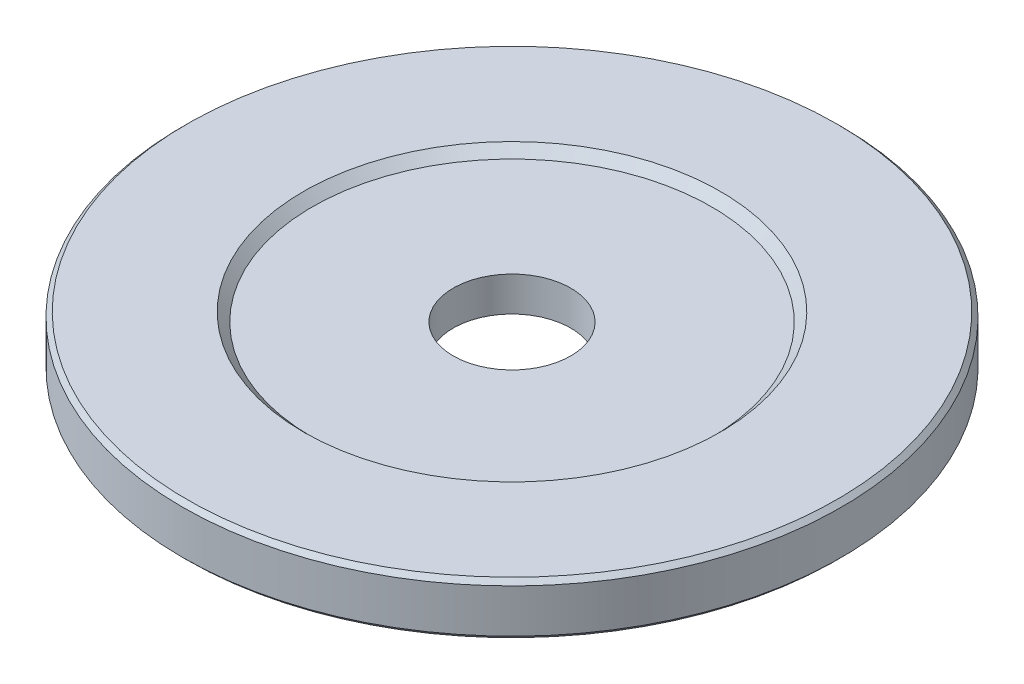
ISO-10303-21;
HEADER;
FILE_DESCRIPTION(('STEP AP214'),'2;1');
FILE_NAME('part.step','',(''),(''),'','','');
FILE_SCHEMA(('AUTOMOTIVE_DESIGN { 1 0 10303 214 1 1 1 1 }'));
ENDSEC;
DATA;
#1=APPLICATION_CONTEXT('core data for automotive mechanical design processes');
#2=APPLICATION_PROTOCOL_DEFINITION('international standard','automotive_design',2000,#1);
#3=PRODUCT_CONTEXT('',#1,'mechanical');
#4=PRODUCT('Part','Part','',(#3));
#5=PRODUCT_RELATED_PRODUCT_CATEGORY('part','',(#4));
#6=PRODUCT_DEFINITION_FORMATION('','',#4);
#7=PRODUCT_DEFINITION_CONTEXT('part definition',#1,'design');
#8=PRODUCT_DEFINITION('design','',#6,#7);
#9=PRODUCT_DEFINITION_SHAPE('','',#8);
#10=(LENGTH_UNIT() NAMED_UNIT(*) SI_UNIT(.MILLI.,.METRE.));
#11=(NAMED_UNIT(*) PLANE_ANGLE_UNIT() SI_UNIT($,.RADIAN.));
#12=(NAMED_UNIT(*) SI_UNIT($,.STERADIAN.) SOLID_ANGLE_UNIT());
#13=UNCERTAINTY_MEASURE_WITH_UNIT(LENGTH_MEASURE(1.E-05),#10,'distance_accuracy_value','');
#14=(GEOMETRIC_REPRESENTATION_CONTEXT(3) GLOBAL_UNCERTAINTY_ASSIGNED_CONTEXT((#13)) GLOBAL_UNIT_ASSIGNED_CONTEXT((#10,
#11,#12)) REPRESENTATION_CONTEXT('',''));
#15=CARTESIAN_POINT('',(0.,0.,0.));
#16=DIRECTION('',(0.,0.,1.));
#17=DIRECTION('',(1.,0.,0.));
#18=AXIS2_PLACEMENT_3D('',#15,#16,#17);
#19=CARTESIAN_POINT('',(-8.93437643856032,24.0645942174068,-4.68703766131284));
#20=DIRECTION('',(0.,1.,0.));
#21=DIRECTION('',(0.,0.,1.));
#22=AXIS2_PLACEMENT_3D('',#19,#20,#21);
#23=CYLINDRICAL_SURFACE('',#22,18.8722);
#24=CARTESIAN_POINT('',(-8.93437643856032,12.5923729406541,-4.68703766131284));
#25=DIRECTION('',(0.,1.,0.));
#26=DIRECTION('',(0.,0.,1.));
#27=AXIS2_PLACEMENT_3D('',#24,#25,#26);
#28=CIRCLE('',#27,18.8722);
#29=CARTESIAN_POINT('',(-8.93437643856032,12.5923729406541,14.1851623386872));
#30=VERTEX_POINT('',#29);
#31=EDGE_CURVE('E29',#30,#30,#28,.T.);
#32=ORIENTED_EDGE('',*,*,#31,.T.);
#33=EDGE_LOOP('',(#32));
#34=FACE_BOUND('',#33,.T.);
#35=CARTESIAN_POINT('',(-8.93437643856032,15.0843729406542,-4.68703766131284));
#36=DIRECTION('',(0.,-1.,0.));
#37=DIRECTION('',(0.,0.,-1.));
#38=AXIS2_PLACEMENT_3D('',#35,#36,#37);
#39=CIRCLE('',#38,18.8722);
#40=CARTESIAN_POINT('',(-8.93437643856032,15.0843729406542,-23.5592376613128));
#41=VERTEX_POINT('',#40);
#42=EDGE_CURVE('E35',#41,#41,#39,.T.);
#43=ORIENTED_EDGE('',*,*,#42,.T.);
#44=EDGE_LOOP('',(#43));
#45=FACE_BOUND('',#44,.T.);
#46=ADVANCED_FACE('F14',(#34,#45),#23,.T.);
#47=CARTESIAN_POINT('',(9.93782356143968,12.3383729406542,-4.68703766131284));
#48=DIRECTION('',(0.,1.,0.));
#49=DIRECTION('',(0.,0.,1.));
#50=AXIS2_PLACEMENT_3D('',#47,#48,#49);
#51=PLANE('',#50);
#52=CARTESIAN_POINT('',(-8.93437643856032,12.3383729406542,-4.68703766131284));
#53=DIRECTION('',(0.,1.,0.));
#54=DIRECTION('',(0.,0.,1.));
#55=AXIS2_PLACEMENT_3D('',#52,#53,#54);
#56=CIRCLE('',#55,18.6182);
#57=CARTESIAN_POINT('',(-8.93437643856032,12.3383729406542,13.9311623386872));
#58=VERTEX_POINT('',#57);
#59=EDGE_CURVE('E22',#58,#58,#56,.F.);
#60=ORIENTED_EDGE('',*,*,#59,.T.);
#61=EDGE_LOOP('',(#60));
#62=FACE_BOUND('',#61,.T.);
#63=CARTESIAN_POINT('',(-8.93437643856032,12.3383729406542,-4.68703766131284));
#64=DIRECTION('',(0.,1.,0.));
#65=DIRECTION('',(0.,0.,1.));
#66=AXIS2_PLACEMENT_3D('',#63,#64,#65);
#67=CIRCLE('',#66,11.938);
#68=CARTESIAN_POINT('',(-8.93437643856032,12.3383729406542,7.25096233868716));
#69=VERTEX_POINT('',#68);
#70=EDGE_CURVE('E41',#69,#69,#67,.T.);
#71=ORIENTED_EDGE('',*,*,#70,.T.);
#72=EDGE_LOOP('',(#71));
#73=FACE_BOUND('',#72,.T.);
#74=ADVANCED_FACE('F83',(#62,#73),#51,.F.);
#75=CARTESIAN_POINT('',(-8.93437643856032,12.8463729406542,-4.68703766131284));
#76=DIRECTION('',(0.,-1.,0.));
#77=DIRECTION('',(0.,0.,-1.));
#78=AXIS2_PLACEMENT_3D('',#75,#76,#77);
#79=CONICAL_SURFACE('',#78,11.43,0.785398163397447);
#80=ORIENTED_EDGE('',*,*,#70,.F.);
#81=EDGE_LOOP('',(#80));
#82=FACE_BOUND('',#81,.T.);
#83=CARTESIAN_POINT('',(-8.93437643856032,12.8463729406542,-4.68703766131284));
#84=DIRECTION('',(0.,1.,0.));
#85=DIRECTION('',(0.,0.,1.));
#86=AXIS2_PLACEMENT_3D('',#83,#84,#85);
#87=CIRCLE('',#86,11.43);
#88=CARTESIAN_POINT('',(-8.93437643856032,12.8463729406542,6.74296233868716));
#89=VERTEX_POINT('',#88);
#90=EDGE_CURVE('E45',#89,#89,#87,.T.);
#91=ORIENTED_EDGE('',*,*,#90,.T.);
#92=EDGE_LOOP('',(#91));
#93=FACE_BOUND('',#92,.T.);
#94=ADVANCED_FACE('F89',(#82,#93),#79,.F.);
#95=CARTESIAN_POINT('',(2.49562356143968,12.8463729406542,-4.68703766131284));
#96=DIRECTION('',(0.,1.,0.));
#97=DIRECTION('',(0.,0.,1.));
#98=AXIS2_PLACEMENT_3D('',#95,#96,#97);
#99=PLANE('',#98);
#100=ORIENTED_EDGE('',*,*,#90,.F.);
#101=EDGE_LOOP('',(#100));
#102=FACE_BOUND('',#101,.T.);
#103=CARTESIAN_POINT('',(-8.93437643856032,12.8463729406542,-4.68703766131284));
#104=DIRECTION('',(0.,1.,0.));
#105=DIRECTION('',(0.,0.,1.));
#106=AXIS2_PLACEMENT_3D('',#103,#104,#105);
#107=CIRCLE('',#106,3.3655);
#108=CARTESIAN_POINT('',(-8.93437643856032,12.8463729406542,-1.32153766131284));
#109=VERTEX_POINT('',#108);
#110=EDGE_CURVE('E49',#109,#109,#107,.T.);
#111=ORIENTED_EDGE('',*,*,#110,.T.);
#112=EDGE_LOOP('',(#111));
#113=FACE_BOUND('',#112,.T.);
#114=ADVANCED_FACE('F95',(#102,#113),#99,.F.);
#115=CARTESIAN_POINT('',(-8.93437643856032,24.0645942174068,-4.68703766131284));
#116=DIRECTION('',(0.,1.,0.));
#117=DIRECTION('',(0.,0.,1.));
#118=AXIS2_PLACEMENT_3D('',#115,#116,#117);
#119=CYLINDRICAL_SURFACE('',#118,3.3655);
#120=ORIENTED_EDGE('',*,*,#110,.F.);
#121=EDGE_LOOP('',(#120));
#122=FACE_BOUND('',#121,.T.);
#123=CARTESIAN_POINT('',(-8.93437643856032,14.8303729406542,-4.68703766131284));
#124=DIRECTION('',(0.,1.,0.));
#125=DIRECTION('',(0.,0.,1.));
#126=AXIS2_PLACEMENT_3D('',#123,#124,#125);
#127=CIRCLE('',#126,3.3655);
#128=CARTESIAN_POINT('',(-8.93437643856032,14.8303729406542,-1.32153766131284));
#129=VERTEX_POINT('',#128);
#130=EDGE_CURVE('E53',#129,#129,#127,.T.);
#131=ORIENTED_EDGE('',*,*,#130,.T.);
#132=EDGE_LOOP('',(#131));
#133=FACE_BOUND('',#132,.T.);
#134=ADVANCED_FACE('F99',(#122,#133),#119,.F.);
#135=CARTESIAN_POINT('',(2.49562356143968,14.8303729406542,-4.68703766131284));
#136=DIRECTION('',(0.,-1.,0.));
#137=DIRECTION('',(0.,0.,-1.));
#138=AXIS2_PLACEMENT_3D('',#135,#136,#137);
#139=PLANE('',#138);
#140=ORIENTED_EDGE('',*,*,#130,.F.);
#141=EDGE_LOOP('',(#140));
#142=FACE_BOUND('',#141,.T.);
#143=CARTESIAN_POINT('',(-8.93437643856032,14.8303729406542,-4.68703766131284));
#144=DIRECTION('',(0.,1.,0.));
#145=DIRECTION('',(0.,0.,1.));
#146=AXIS2_PLACEMENT_3D('',#143,#144,#145);
#147=CIRCLE('',#146,11.43);
#148=CARTESIAN_POINT('',(-8.93437643856032,14.8303729406542,6.74296233868716));
#149=VERTEX_POINT('',#148);
#150=EDGE_CURVE('E57',#149,#149,#147,.T.);
#151=ORIENTED_EDGE('',*,*,#150,.T.);
#152=EDGE_LOOP('',(#151));
#153=FACE_BOUND('',#152,.T.);
#154=ADVANCED_FACE('F79',(#142,#153),#139,.F.);
#155=CARTESIAN_POINT('',(-8.93437643856032,15.3383729406542,-4.68703766131284));
#156=DIRECTION('',(0.,1.,0.));
#157=DIRECTION('',(0.,0.,1.));
#158=AXIS2_PLACEMENT_3D('',#155,#156,#157);
#159=CONICAL_SURFACE('',#158,11.938,0.785398163397453);
#160=ORIENTED_EDGE('',*,*,#150,.F.);
#161=EDGE_LOOP('',(#160));
#162=FACE_BOUND('',#161,.T.);
#163=CARTESIAN_POINT('',(-8.93437643856032,15.3383729406542,-4.68703766131284));
#164=DIRECTION('',(0.,1.,0.));
#165=DIRECTION('',(0.,0.,1.));
#166=AXIS2_PLACEMENT_3D('',#163,#164,#165);
#167=CIRCLE('',#166,11.938);
#168=CARTESIAN_POINT('',(-8.93437643856032,15.3383729406542,7.25096233868716));
#169=VERTEX_POINT('',#168);
#170=EDGE_CURVE('E61',#169,#169,#167,.T.);
#171=ORIENTED_EDGE('',*,*,#170,.T.);
#172=EDGE_LOOP('',(#171));
#173=FACE_BOUND('',#172,.T.);
#174=ADVANCED_FACE('F67',(#162,#173),#159,.F.);
#175=CARTESIAN_POINT('',(3.00362356143969,15.3383729406542,-4.68703766131284));
#176=DIRECTION('',(0.,-1.,0.));
#177=DIRECTION('',(0.,0.,-1.));
#178=AXIS2_PLACEMENT_3D('',#175,#176,#177);
#179=PLANE('',#178);
#180=CARTESIAN_POINT('',(-8.93437643856032,15.3383729406542,-4.68703766131284));
#181=DIRECTION('',(0.,-1.,0.));
#182=DIRECTION('',(0.,0.,-1.));
#183=AXIS2_PLACEMENT_3D('',#180,#181,#182);
#184=CIRCLE('',#183,18.6182);
#185=CARTESIAN_POINT('',(-8.93437643856032,15.3383729406542,-23.3052376613128));
#186=VERTEX_POINT('',#185);
#187=EDGE_CURVE('E10',#186,#186,#184,.F.);
#188=ORIENTED_EDGE('',*,*,#187,.T.);
#189=EDGE_LOOP('',(#188));
#190=FACE_BOUND('',#189,.T.);
#191=ORIENTED_EDGE('',*,*,#170,.F.);
#192=EDGE_LOOP('',(#191));
#193=FACE_BOUND('',#192,.T.);
#194=ADVANCED_FACE('F69',(#190,#193),#179,.F.);
#195=CARTESIAN_POINT('',(-8.93437643856032,12.5923729406541,-4.68703766131284));
#196=DIRECTION('',(0.,1.,0.));
#197=DIRECTION('',(0.,0.,1.));
#198=AXIS2_PLACEMENT_3D('',#195,#196,#197);
#199=CONICAL_SURFACE('',#198,18.8722,0.785398163397455);
#200=ORIENTED_EDGE('',*,*,#59,.F.);
#201=EDGE_LOOP('',(#200));
#202=FACE_BOUND('',#201,.T.);
#203=ORIENTED_EDGE('',*,*,#31,.F.);
#204=EDGE_LOOP('',(#203));
#205=FACE_BOUND('',#204,.T.);
#206=ADVANCED_FACE('F71',(#202,#205),#199,.T.);
#207=CARTESIAN_POINT('',(-8.93437643856032,15.3383729406542,-4.68703766131284));
#208=DIRECTION('',(0.,-1.,0.));
#209=DIRECTION('',(0.,0.,-1.));
#210=AXIS2_PLACEMENT_3D('',#207,#208,#209);
#211=CONICAL_SURFACE('',#210,18.6182,0.785398163397455);
#212=ORIENTED_EDGE('',*,*,#42,.F.);
#213=EDGE_LOOP('',(#212));
#214=FACE_BOUND('',#213,.T.);
#215=ORIENTED_EDGE('',*,*,#187,.F.);
#216=EDGE_LOOP('',(#215));
#217=FACE_BOUND('',#216,.T.);
#218=ADVANCED_FACE('F16',(#214,#217),#211,.T.);
#219=CLOSED_SHELL('',(#46,#74,#94,#114,#134,#154,#174,#194,#206,#218));
#220=MANIFOLD_SOLID_BREP('B1',#219);
#221=ADVANCED_BREP_SHAPE_REPRESENTATION('',(#18,#220),#14);
#222=SHAPE_DEFINITION_REPRESENTATION(#9,#221);
ENDSEC;
END-ISO-10303-21;
